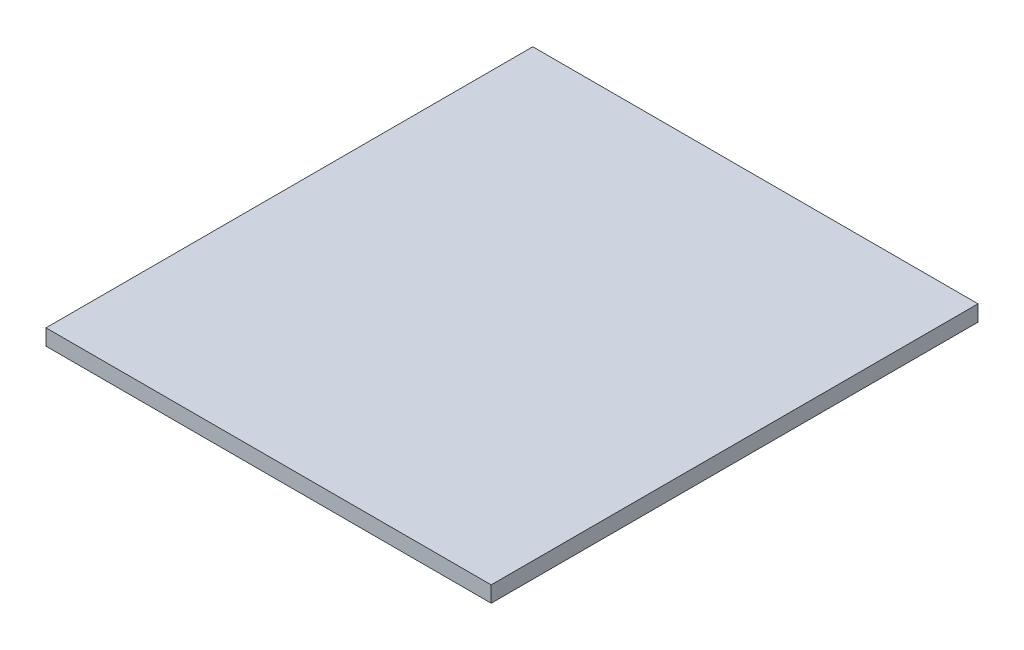
ISO-10303-21;
HEADER;
FILE_DESCRIPTION(('STEP AP214'),'2;1');
FILE_NAME('part.step','',(''),(''),'','','');
FILE_SCHEMA(('AUTOMOTIVE_DESIGN { 1 0 10303 214 1 1 1 1 }'));
ENDSEC;
DATA;
#1=APPLICATION_CONTEXT('core data for automotive mechanical design processes');
#2=APPLICATION_PROTOCOL_DEFINITION('international standard','automotive_design',2000,#1);
#3=PRODUCT_CONTEXT('',#1,'mechanical');
#4=PRODUCT('Part','Part','',(#3));
#5=PRODUCT_RELATED_PRODUCT_CATEGORY('part','',(#4));
#6=PRODUCT_DEFINITION_FORMATION('','',#4);
#7=PRODUCT_DEFINITION_CONTEXT('part definition',#1,'design');
#8=PRODUCT_DEFINITION('design','',#6,#7);
#9=PRODUCT_DEFINITION_SHAPE('','',#8);
#10=(LENGTH_UNIT() NAMED_UNIT(*) SI_UNIT(.MILLI.,.METRE.));
#11=(NAMED_UNIT(*) PLANE_ANGLE_UNIT() SI_UNIT($,.RADIAN.));
#12=(NAMED_UNIT(*) SI_UNIT($,.STERADIAN.) SOLID_ANGLE_UNIT());
#13=UNCERTAINTY_MEASURE_WITH_UNIT(LENGTH_MEASURE(1.E-05),#10,'distance_accuracy_value','');
#14=(GEOMETRIC_REPRESENTATION_CONTEXT(3) GLOBAL_UNCERTAINTY_ASSIGNED_CONTEXT((#13)) GLOBAL_UNIT_ASSIGNED_CONTEXT((#10,
#11,#12)) REPRESENTATION_CONTEXT('',''));
#15=CARTESIAN_POINT('',(0.,0.,0.));
#16=DIRECTION('',(0.,0.,1.));
#17=DIRECTION('',(1.,0.,0.));
#18=AXIS2_PLACEMENT_3D('',#15,#16,#17);
#19=CARTESIAN_POINT('',(251.5,18.,-275.));
#20=DIRECTION('',(-1.,0.,0.));
#21=DIRECTION('',(0.,0.,1.));
#22=AXIS2_PLACEMENT_3D('',#19,#20,#21);
#23=PLANE('',#22);
#24=DIRECTION('',(0.,0.,-1.));
#25=VECTOR('',#24,1.);
#26=CARTESIAN_POINT('',(251.5,0.,-275.));
#27=LINE('',#26,#25);
#28=CARTESIAN_POINT('',(251.5,0.,275.));
#29=VERTEX_POINT('',#28);
#30=CARTESIAN_POINT('',(251.5,0.,-275.));
#31=VERTEX_POINT('',#30);
#32=EDGE_CURVE('E96',#29,#31,#27,.T.);
#33=ORIENTED_EDGE('',*,*,#32,.T.);
#34=DIRECTION('',(0.,-1.,0.));
#35=VECTOR('',#34,1.);
#36=CARTESIAN_POINT('',(251.5,18.,-275.));
#37=LINE('',#36,#35);
#38=CARTESIAN_POINT('',(251.5,18.,-275.));
#39=VERTEX_POINT('',#38);
#40=EDGE_CURVE('E11',#39,#31,#37,.T.);
#41=ORIENTED_EDGE('',*,*,#40,.F.);
#42=DIRECTION('',(0.,0.,-1.));
#43=VECTOR('',#42,1.);
#44=CARTESIAN_POINT('',(251.5,18.,-275.));
#45=LINE('',#44,#43);
#46=CARTESIAN_POINT('',(251.5,18.,275.));
#47=VERTEX_POINT('',#46);
#48=EDGE_CURVE('E84',#47,#39,#45,.T.);
#49=ORIENTED_EDGE('',*,*,#48,.F.);
#50=DIRECTION('',(0.,-1.,0.));
#51=VECTOR('',#50,1.);
#52=CARTESIAN_POINT('',(251.5,18.,275.));
#53=LINE('',#52,#51);
#54=EDGE_CURVE('E92',#47,#29,#53,.T.);
#55=ORIENTED_EDGE('',*,*,#54,.T.);
#56=EDGE_LOOP('',(#33,#41,#49,#55));
#57=FACE_BOUND('',#56,.T.);
#58=ADVANCED_FACE('F33',(#57),#23,.F.);
#59=CARTESIAN_POINT('',(-251.5,18.,-275.));
#60=DIRECTION('',(0.,0.,1.));
#61=DIRECTION('',(1.,0.,0.));
#62=AXIS2_PLACEMENT_3D('',#59,#60,#61);
#63=PLANE('',#62);
#64=DIRECTION('',(-1.,0.,0.));
#65=VECTOR('',#64,1.);
#66=CARTESIAN_POINT('',(-251.5,0.,-275.));
#67=LINE('',#66,#65);
#68=CARTESIAN_POINT('',(-251.5,0.,-275.));
#69=VERTEX_POINT('',#68);
#70=EDGE_CURVE('E88',#31,#69,#67,.T.);
#71=ORIENTED_EDGE('',*,*,#70,.T.);
#72=DIRECTION('',(0.,-1.,0.));
#73=VECTOR('',#72,1.);
#74=CARTESIAN_POINT('',(-251.5,18.,-275.));
#75=LINE('',#74,#73);
#76=CARTESIAN_POINT('',(-251.5,18.,-275.));
#77=VERTEX_POINT('',#76);
#78=EDGE_CURVE('E41',#77,#69,#75,.T.);
#79=ORIENTED_EDGE('',*,*,#78,.F.);
#80=DIRECTION('',(-1.,0.,0.));
#81=VECTOR('',#80,1.);
#82=CARTESIAN_POINT('',(-251.5,18.,-275.));
#83=LINE('',#82,#81);
#84=EDGE_CURVE('E79',#39,#77,#83,.T.);
#85=ORIENTED_EDGE('',*,*,#84,.F.);
#86=ORIENTED_EDGE('',*,*,#40,.T.);
#87=EDGE_LOOP('',(#71,#79,#85,#86));
#88=FACE_BOUND('',#87,.T.);
#89=ADVANCED_FACE('F87',(#88),#63,.F.);
#90=CARTESIAN_POINT('',(-251.5,18.,-275.));
#91=DIRECTION('',(1.,0.,0.));
#92=DIRECTION('',(0.,0.,-1.));
#93=AXIS2_PLACEMENT_3D('',#90,#91,#92);
#94=PLANE('',#93);
#95=DIRECTION('',(0.,0.,1.));
#96=VECTOR('',#95,1.);
#97=CARTESIAN_POINT('',(-251.5,0.,-275.));
#98=LINE('',#97,#96);
#99=CARTESIAN_POINT('',(-251.5,0.,275.));
#100=VERTEX_POINT('',#99);
#101=EDGE_CURVE('E66',#69,#100,#98,.T.);
#102=ORIENTED_EDGE('',*,*,#101,.T.);
#103=DIRECTION('',(0.,-1.,0.));
#104=VECTOR('',#103,1.);
#105=CARTESIAN_POINT('',(-251.5,18.,275.));
#106=LINE('',#105,#104);
#107=CARTESIAN_POINT('',(-251.5,18.,275.));
#108=VERTEX_POINT('',#107);
#109=EDGE_CURVE('E89',#108,#100,#106,.T.);
#110=ORIENTED_EDGE('',*,*,#109,.F.);
#111=DIRECTION('',(0.,0.,1.));
#112=VECTOR('',#111,1.);
#113=CARTESIAN_POINT('',(-251.5,18.,-275.));
#114=LINE('',#113,#112);
#115=EDGE_CURVE('E82',#77,#108,#114,.T.);
#116=ORIENTED_EDGE('',*,*,#115,.F.);
#117=ORIENTED_EDGE('',*,*,#78,.T.);
#118=EDGE_LOOP('',(#102,#110,#116,#117));
#119=FACE_BOUND('',#118,.T.);
#120=ADVANCED_FACE('F90',(#119),#94,.F.);
#121=CARTESIAN_POINT('',(-251.5,18.,275.));
#122=DIRECTION('',(0.,0.,-1.));
#123=DIRECTION('',(-1.,0.,0.));
#124=AXIS2_PLACEMENT_3D('',#121,#122,#123);
#125=PLANE('',#124);
#126=DIRECTION('',(1.,0.,0.));
#127=VECTOR('',#126,1.);
#128=CARTESIAN_POINT('',(-251.5,0.,275.));
#129=LINE('',#128,#127);
#130=EDGE_CURVE('E72',#100,#29,#129,.T.);
#131=ORIENTED_EDGE('',*,*,#130,.T.);
#132=ORIENTED_EDGE('',*,*,#54,.F.);
#133=DIRECTION('',(1.,0.,0.));
#134=VECTOR('',#133,1.);
#135=CARTESIAN_POINT('',(-251.5,18.,275.));
#136=LINE('',#135,#134);
#137=EDGE_CURVE('E49',#108,#47,#136,.T.);
#138=ORIENTED_EDGE('',*,*,#137,.F.);
#139=ORIENTED_EDGE('',*,*,#109,.T.);
#140=EDGE_LOOP('',(#131,#132,#138,#139));
#141=FACE_BOUND('',#140,.T.);
#142=ADVANCED_FACE('F103',(#141),#125,.F.);
#143=CARTESIAN_POINT('',(0.,18.,0.));
#144=DIRECTION('',(0.,1.,0.));
#145=DIRECTION('',(0.,0.,1.));
#146=AXIS2_PLACEMENT_3D('',#143,#144,#145);
#147=PLANE('',#146);
#148=ORIENTED_EDGE('',*,*,#48,.T.);
#149=ORIENTED_EDGE('',*,*,#84,.T.);
#150=ORIENTED_EDGE('',*,*,#115,.T.);
#151=ORIENTED_EDGE('',*,*,#137,.T.);
#152=EDGE_LOOP('',(#148,#149,#150,#151));
#153=FACE_BOUND('',#152,.T.);
#154=ADVANCED_FACE('F80',(#153),#147,.T.);
#155=CARTESIAN_POINT('',(0.,0.,0.));
#156=DIRECTION('',(0.,1.,0.));
#157=DIRECTION('',(0.,0.,1.));
#158=AXIS2_PLACEMENT_3D('',#155,#156,#157);
#159=PLANE('',#158);
#160=ORIENTED_EDGE('',*,*,#32,.F.);
#161=ORIENTED_EDGE('',*,*,#130,.F.);
#162=ORIENTED_EDGE('',*,*,#101,.F.);
#163=ORIENTED_EDGE('',*,*,#70,.F.);
#164=EDGE_LOOP('',(#160,#161,#162,#163));
#165=FACE_BOUND('',#164,.T.);
#166=ADVANCED_FACE('F106',(#165),#159,.F.);
#167=CLOSED_SHELL('',(#58,#89,#120,#142,#154,#166));
#168=MANIFOLD_SOLID_BREP('B2',#167);
#169=ADVANCED_BREP_SHAPE_REPRESENTATION('',(#18,#168),#14);
#170=SHAPE_DEFINITION_REPRESENTATION(#9,#169);
ENDSEC;
END-ISO-10303-21;
